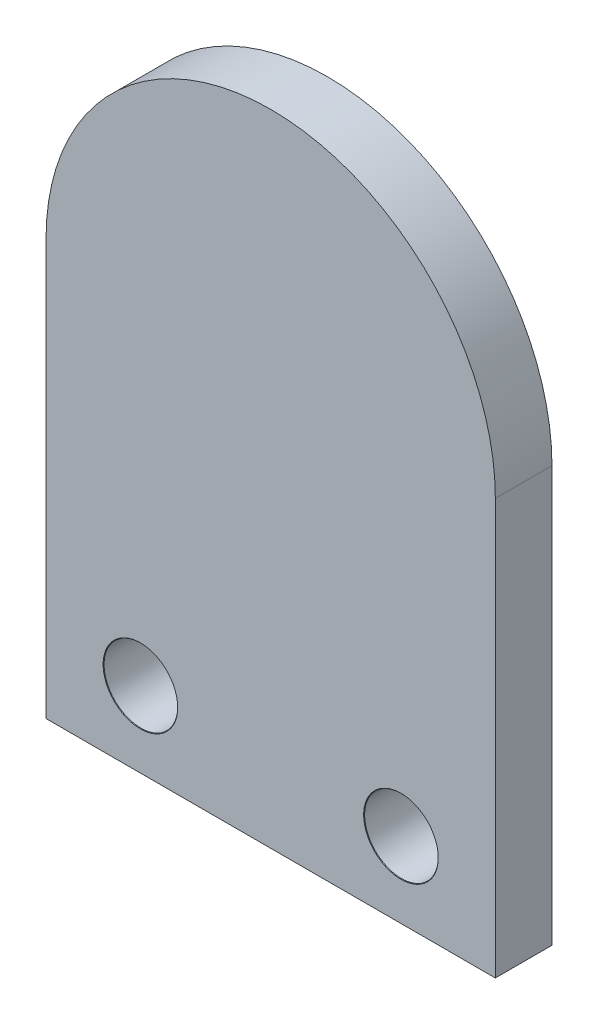
ISO-10303-21;
HEADER;
FILE_DESCRIPTION(('STEP AP214'),'2;1');
FILE_NAME('part.step','',(''),(''),'','','');
FILE_SCHEMA(('AUTOMOTIVE_DESIGN { 1 0 10303 214 1 1 1 1 }'));
ENDSEC;
DATA;
#1=APPLICATION_CONTEXT('core data for automotive mechanical design processes');
#2=APPLICATION_PROTOCOL_DEFINITION('international standard','automotive_design',2000,#1);
#3=PRODUCT_CONTEXT('',#1,'mechanical');
#4=PRODUCT('Part','Part','',(#3));
#5=PRODUCT_RELATED_PRODUCT_CATEGORY('part','',(#4));
#6=PRODUCT_DEFINITION_FORMATION('','',#4);
#7=PRODUCT_DEFINITION_CONTEXT('part definition',#1,'design');
#8=PRODUCT_DEFINITION('design','',#6,#7);
#9=PRODUCT_DEFINITION_SHAPE('','',#8);
#10=(LENGTH_UNIT() NAMED_UNIT(*) SI_UNIT(.MILLI.,.METRE.));
#11=(NAMED_UNIT(*) PLANE_ANGLE_UNIT() SI_UNIT($,.RADIAN.));
#12=(NAMED_UNIT(*) SI_UNIT($,.STERADIAN.) SOLID_ANGLE_UNIT());
#13=UNCERTAINTY_MEASURE_WITH_UNIT(LENGTH_MEASURE(1.E-05),#10,'distance_accuracy_value','');
#14=(GEOMETRIC_REPRESENTATION_CONTEXT(3) GLOBAL_UNCERTAINTY_ASSIGNED_CONTEXT((#13)) GLOBAL_UNIT_ASSIGNED_CONTEXT((#10,
#11,#12)) REPRESENTATION_CONTEXT('',''));
#15=CARTESIAN_POINT('',(0.,0.,0.));
#16=DIRECTION('',(0.,0.,1.));
#17=DIRECTION('',(1.,0.,0.));
#18=AXIS2_PLACEMENT_3D('',#15,#16,#17);
#19=CARTESIAN_POINT('',(0.,0.,3.));
#20=DIRECTION('',(0.,0.,-1.));
#21=DIRECTION('',(-1.,0.,0.));
#22=AXIS2_PLACEMENT_3D('',#19,#20,#21);
#23=CYLINDRICAL_SURFACE('',#22,11.9);
#24=CARTESIAN_POINT('',(0.,0.,0.));
#25=DIRECTION('',(0.,0.,1.));
#26=DIRECTION('',(1.,0.,0.));
#27=AXIS2_PLACEMENT_3D('',#24,#25,#26);
#28=CIRCLE('',#27,11.9);
#29=CARTESIAN_POINT('',(11.9,0.,0.));
#30=VERTEX_POINT('',#29);
#31=CARTESIAN_POINT('',(-11.9,0.,0.));
#32=VERTEX_POINT('',#31);
#33=EDGE_CURVE('E129',#30,#32,#28,.T.);
#34=ORIENTED_EDGE('',*,*,#33,.T.);
#35=DIRECTION('',(0.,0.,-1.));
#36=VECTOR('',#35,1.);
#37=CARTESIAN_POINT('',(-11.9,0.,3.));
#38=LINE('',#37,#36);
#39=CARTESIAN_POINT('',(-11.9,0.,3.));
#40=VERTEX_POINT('',#39);
#41=EDGE_CURVE('E118',#40,#32,#38,.T.);
#42=ORIENTED_EDGE('',*,*,#41,.F.);
#43=CARTESIAN_POINT('',(0.,0.,3.));
#44=DIRECTION('',(0.,0.,1.));
#45=DIRECTION('',(1.,0.,0.));
#46=AXIS2_PLACEMENT_3D('',#43,#44,#45);
#47=CIRCLE('',#46,11.9);
#48=CARTESIAN_POINT('',(11.9,0.,3.));
#49=VERTEX_POINT('',#48);
#50=EDGE_CURVE('E110',#49,#40,#47,.T.);
#51=ORIENTED_EDGE('',*,*,#50,.F.);
#52=DIRECTION('',(0.,0.,-1.));
#53=VECTOR('',#52,1.);
#54=CARTESIAN_POINT('',(11.9,0.,3.));
#55=LINE('',#54,#53);
#56=EDGE_CURVE('E125',#49,#30,#55,.T.);
#57=ORIENTED_EDGE('',*,*,#56,.T.);
#58=EDGE_LOOP('',(#34,#42,#51,#57));
#59=FACE_BOUND('',#58,.T.);
#60=ADVANCED_FACE('F55',(#59),#23,.T.);
#61=CARTESIAN_POINT('',(-11.9,0.,3.));
#62=DIRECTION('',(1.,0.,0.));
#63=DIRECTION('',(0.,0.,-1.));
#64=AXIS2_PLACEMENT_3D('',#61,#62,#63);
#65=PLANE('',#64);
#66=DIRECTION('',(0.,-1.,0.));
#67=VECTOR('',#66,1.);
#68=CARTESIAN_POINT('',(-11.9,0.,0.));
#69=LINE('',#68,#67);
#70=CARTESIAN_POINT('',(-11.9,-22.,0.));
#71=VERTEX_POINT('',#70);
#72=EDGE_CURVE('E116',#32,#71,#69,.T.);
#73=ORIENTED_EDGE('',*,*,#72,.T.);
#74=DIRECTION('',(0.,0.,-1.));
#75=VECTOR('',#74,1.);
#76=CARTESIAN_POINT('',(-11.9,-22.,3.));
#77=LINE('',#76,#75);
#78=CARTESIAN_POINT('',(-11.9,-22.,3.));
#79=VERTEX_POINT('',#78);
#80=EDGE_CURVE('E114',#79,#71,#77,.T.);
#81=ORIENTED_EDGE('',*,*,#80,.F.);
#82=DIRECTION('',(0.,-1.,0.));
#83=VECTOR('',#82,1.);
#84=CARTESIAN_POINT('',(-11.9,0.,3.));
#85=LINE('',#84,#83);
#86=EDGE_CURVE('E105',#40,#79,#85,.T.);
#87=ORIENTED_EDGE('',*,*,#86,.F.);
#88=ORIENTED_EDGE('',*,*,#41,.T.);
#89=EDGE_LOOP('',(#73,#81,#87,#88));
#90=FACE_BOUND('',#89,.T.);
#91=ADVANCED_FACE('F115',(#90),#65,.F.);
#92=CARTESIAN_POINT('',(-11.9,-22.,3.));
#93=DIRECTION('',(0.,1.,0.));
#94=DIRECTION('',(0.,0.,1.));
#95=AXIS2_PLACEMENT_3D('',#92,#93,#94);
#96=PLANE('',#95);
#97=DIRECTION('',(1.,0.,0.));
#98=VECTOR('',#97,1.);
#99=CARTESIAN_POINT('',(-11.9,-22.,0.));
#100=LINE('',#99,#98);
#101=CARTESIAN_POINT('',(11.9,-22.,0.));
#102=VERTEX_POINT('',#101);
#103=EDGE_CURVE('E91',#71,#102,#100,.T.);
#104=ORIENTED_EDGE('',*,*,#103,.T.);
#105=DIRECTION('',(0.,0.,-1.));
#106=VECTOR('',#105,1.);
#107=CARTESIAN_POINT('',(11.9,-22.,3.));
#108=LINE('',#107,#106);
#109=CARTESIAN_POINT('',(11.9,-22.,3.));
#110=VERTEX_POINT('',#109);
#111=EDGE_CURVE('E119',#110,#102,#108,.T.);
#112=ORIENTED_EDGE('',*,*,#111,.F.);
#113=DIRECTION('',(1.,0.,0.));
#114=VECTOR('',#113,1.);
#115=CARTESIAN_POINT('',(-11.9,-22.,3.));
#116=LINE('',#115,#114);
#117=EDGE_CURVE('E108',#79,#110,#116,.T.);
#118=ORIENTED_EDGE('',*,*,#117,.F.);
#119=ORIENTED_EDGE('',*,*,#80,.T.);
#120=EDGE_LOOP('',(#104,#112,#118,#119));
#121=FACE_BOUND('',#120,.T.);
#122=ADVANCED_FACE('F121',(#121),#96,.F.);
#123=CARTESIAN_POINT('',(11.9,-22.,3.));
#124=DIRECTION('',(-1.,0.,0.));
#125=DIRECTION('',(0.,0.,1.));
#126=AXIS2_PLACEMENT_3D('',#123,#124,#125);
#127=PLANE('',#126);
#128=DIRECTION('',(0.,1.,0.));
#129=VECTOR('',#128,1.);
#130=CARTESIAN_POINT('',(11.9,-22.,0.));
#131=LINE('',#130,#129);
#132=EDGE_CURVE('E97',#102,#30,#131,.T.);
#133=ORIENTED_EDGE('',*,*,#132,.T.);
#134=ORIENTED_EDGE('',*,*,#56,.F.);
#135=DIRECTION('',(0.,1.,0.));
#136=VECTOR('',#135,1.);
#137=CARTESIAN_POINT('',(11.9,-22.,3.));
#138=LINE('',#137,#136);
#139=EDGE_CURVE('E74',#110,#49,#138,.T.);
#140=ORIENTED_EDGE('',*,*,#139,.F.);
#141=ORIENTED_EDGE('',*,*,#111,.T.);
#142=EDGE_LOOP('',(#133,#134,#140,#141));
#143=FACE_BOUND('',#142,.T.);
#144=ADVANCED_FACE('F205',(#143),#127,.F.);
#145=CARTESIAN_POINT('',(0.,0.,3.));
#146=DIRECTION('',(0.,0.,1.));
#147=DIRECTION('',(1.,0.,0.));
#148=AXIS2_PLACEMENT_3D('',#145,#146,#147);
#149=PLANE('',#148);
#150=CARTESIAN_POINT('',(6.89999999999974,-18.,3.));
#151=DIRECTION('',(0.,0.,1.));
#152=DIRECTION('',(1.,0.,0.));
#153=AXIS2_PLACEMENT_3D('',#150,#151,#152);
#154=CIRCLE('',#153,1.975);
#155=CARTESIAN_POINT('',(8.87499999999974,-18.,3.));
#156=VERTEX_POINT('',#155);
#157=EDGE_CURVE('E406',#156,#156,#154,.T.);
#158=ORIENTED_EDGE('',*,*,#157,.F.);
#159=EDGE_LOOP('',(#158));
#160=FACE_BOUND('',#159,.T.);
#161=CARTESIAN_POINT('',(-6.90000000000027,-18.,3.));
#162=DIRECTION('',(0.,0.,1.));
#163=DIRECTION('',(1.,0.,0.));
#164=AXIS2_PLACEMENT_3D('',#161,#162,#163);
#165=CIRCLE('',#164,1.975);
#166=CARTESIAN_POINT('',(-4.92500000000026,-18.,3.));
#167=VERTEX_POINT('',#166);
#168=EDGE_CURVE('E169',#167,#167,#165,.T.);
#169=ORIENTED_EDGE('',*,*,#168,.F.);
#170=EDGE_LOOP('',(#169));
#171=FACE_BOUND('',#170,.T.);
#172=ORIENTED_EDGE('',*,*,#50,.T.);
#173=ORIENTED_EDGE('',*,*,#86,.T.);
#174=ORIENTED_EDGE('',*,*,#117,.T.);
#175=ORIENTED_EDGE('',*,*,#139,.T.);
#176=EDGE_LOOP('',(#172,#173,#174,#175));
#177=FACE_BOUND('',#176,.T.);
#178=ADVANCED_FACE('F106',(#160,#171,#177),#149,.T.);
#179=CARTESIAN_POINT('',(0.,0.,0.));
#180=DIRECTION('',(0.,0.,1.));
#181=DIRECTION('',(1.,0.,0.));
#182=AXIS2_PLACEMENT_3D('',#179,#180,#181);
#183=PLANE('',#182);
#184=CARTESIAN_POINT('',(6.89999999999974,-18.,0.));
#185=DIRECTION('',(0.,0.,1.));
#186=DIRECTION('',(1.,0.,0.));
#187=AXIS2_PLACEMENT_3D('',#184,#185,#186);
#188=CIRCLE('',#187,1.95);
#189=CARTESIAN_POINT('',(8.84999999999973,-18.,0.));
#190=VERTEX_POINT('',#189);
#191=EDGE_CURVE('E58',#190,#190,#188,.T.);
#192=ORIENTED_EDGE('',*,*,#191,.T.);
#193=EDGE_LOOP('',(#192));
#194=FACE_BOUND('',#193,.T.);
#195=CARTESIAN_POINT('',(-6.90000000000027,-18.,0.));
#196=DIRECTION('',(0.,0.,1.));
#197=DIRECTION('',(1.,0.,0.));
#198=AXIS2_PLACEMENT_3D('',#195,#196,#197);
#199=CIRCLE('',#198,1.95);
#200=CARTESIAN_POINT('',(-4.95000000000027,-18.,0.));
#201=VERTEX_POINT('',#200);
#202=EDGE_CURVE('E156',#201,#201,#199,.T.);
#203=ORIENTED_EDGE('',*,*,#202,.T.);
#204=EDGE_LOOP('',(#203));
#205=FACE_BOUND('',#204,.T.);
#206=CARTESIAN_POINT('',(6.,0.,0.));
#207=DIRECTION('',(0.,0.,1.));
#208=DIRECTION('',(1.,0.,0.));
#209=AXIS2_PLACEMENT_3D('',#206,#207,#208);
#210=CIRCLE('',#209,1.95);
#211=CARTESIAN_POINT('',(7.95,0.,0.));
#212=VERTEX_POINT('',#211);
#213=EDGE_CURVE('E13',#212,#212,#210,.F.);
#214=ORIENTED_EDGE('',*,*,#213,.F.);
#215=EDGE_LOOP('',(#214));
#216=FACE_BOUND('',#215,.T.);
#217=CARTESIAN_POINT('',(-1.68325892343959E-13,-6.,0.));
#218=DIRECTION('',(0.,0.,1.));
#219=DIRECTION('',(1.,0.,0.));
#220=AXIS2_PLACEMENT_3D('',#217,#218,#219);
#221=CIRCLE('',#220,1.9500000000002);
#222=CARTESIAN_POINT('',(1.95000000000003,-6.,0.));
#223=VERTEX_POINT('',#222);
#224=EDGE_CURVE('E65',#223,#223,#221,.F.);
#225=ORIENTED_EDGE('',*,*,#224,.F.);
#226=EDGE_LOOP('',(#225));
#227=FACE_BOUND('',#226,.T.);
#228=CARTESIAN_POINT('',(-6.,0.,0.));
#229=DIRECTION('',(0.,0.,1.));
#230=DIRECTION('',(1.,0.,0.));
#231=AXIS2_PLACEMENT_3D('',#228,#229,#230);
#232=CIRCLE('',#231,1.95);
#233=CARTESIAN_POINT('',(-4.05,0.,0.));
#234=VERTEX_POINT('',#233);
#235=EDGE_CURVE('E150',#234,#234,#232,.F.);
#236=ORIENTED_EDGE('',*,*,#235,.F.);
#237=EDGE_LOOP('',(#236));
#238=FACE_BOUND('',#237,.T.);
#239=CARTESIAN_POINT('',(0.,6.,0.));
#240=DIRECTION('',(0.,0.,1.));
#241=DIRECTION('',(1.,0.,0.));
#242=AXIS2_PLACEMENT_3D('',#239,#240,#241);
#243=CIRCLE('',#242,1.95);
#244=CARTESIAN_POINT('',(1.95,6.,0.));
#245=VERTEX_POINT('',#244);
#246=EDGE_CURVE('E146',#245,#245,#243,.F.);
#247=ORIENTED_EDGE('',*,*,#246,.F.);
#248=EDGE_LOOP('',(#247));
#249=FACE_BOUND('',#248,.T.);
#250=ORIENTED_EDGE('',*,*,#33,.F.);
#251=ORIENTED_EDGE('',*,*,#132,.F.);
#252=ORIENTED_EDGE('',*,*,#103,.F.);
#253=ORIENTED_EDGE('',*,*,#72,.F.);
#254=EDGE_LOOP('',(#250,#251,#252,#253));
#255=FACE_BOUND('',#254,.T.);
#256=ADVANCED_FACE('F195',(#194,#205,#216,#227,#238,#249,#255),#183,.F.);
#257=CARTESIAN_POINT('',(0.,6.,-3.));
#258=DIRECTION('',(0.,0.,1.));
#259=DIRECTION('',(1.,0.,0.));
#260=AXIS2_PLACEMENT_3D('',#257,#258,#259);
#261=CYLINDRICAL_SURFACE('',#260,1.95);
#262=CARTESIAN_POINT('',(0.,6.,-3.));
#263=DIRECTION('',(0.,0.,-1.));
#264=DIRECTION('',(-1.,0.,0.));
#265=AXIS2_PLACEMENT_3D('',#262,#263,#264);
#266=CIRCLE('',#265,1.95);
#267=CARTESIAN_POINT('',(-1.95,6.,-3.));
#268=VERTEX_POINT('',#267);
#269=EDGE_CURVE('E133',#268,#268,#266,.T.);
#270=ORIENTED_EDGE('',*,*,#269,.F.);
#271=EDGE_LOOP('',(#270));
#272=FACE_BOUND('',#271,.T.);
#273=ORIENTED_EDGE('',*,*,#246,.T.);
#274=EDGE_LOOP('',(#273));
#275=FACE_BOUND('',#274,.T.);
#276=ADVANCED_FACE('F192',(#272,#275),#261,.T.);
#277=CARTESIAN_POINT('',(0.,6.,-3.));
#278=DIRECTION('',(0.,0.,-1.));
#279=DIRECTION('',(-1.,0.,0.));
#280=AXIS2_PLACEMENT_3D('',#277,#278,#279);
#281=PLANE('',#280);
#282=ORIENTED_EDGE('',*,*,#269,.T.);
#283=EDGE_LOOP('',(#282));
#284=FACE_BOUND('',#283,.T.);
#285=ADVANCED_FACE('F190',(#284),#281,.T.);
#286=CARTESIAN_POINT('',(-6.,0.,-3.));
#287=DIRECTION('',(0.,0.,1.));
#288=DIRECTION('',(1.,0.,0.));
#289=AXIS2_PLACEMENT_3D('',#286,#287,#288);
#290=CYLINDRICAL_SURFACE('',#289,1.95);
#291=CARTESIAN_POINT('',(-6.,0.,-3.));
#292=DIRECTION('',(0.,0.,-1.));
#293=DIRECTION('',(-1.,0.,0.));
#294=AXIS2_PLACEMENT_3D('',#291,#292,#293);
#295=CIRCLE('',#294,1.95);
#296=CARTESIAN_POINT('',(-7.95,0.,-3.));
#297=VERTEX_POINT('',#296);
#298=EDGE_CURVE('E181',#297,#297,#295,.T.);
#299=ORIENTED_EDGE('',*,*,#298,.F.);
#300=EDGE_LOOP('',(#299));
#301=FACE_BOUND('',#300,.T.);
#302=ORIENTED_EDGE('',*,*,#235,.T.);
#303=EDGE_LOOP('',(#302));
#304=FACE_BOUND('',#303,.T.);
#305=ADVANCED_FACE('F249',(#301,#304),#290,.T.);
#306=CARTESIAN_POINT('',(-6.,0.,-3.));
#307=DIRECTION('',(0.,0.,-1.));
#308=DIRECTION('',(-1.,0.,0.));
#309=AXIS2_PLACEMENT_3D('',#306,#307,#308);
#310=PLANE('',#309);
#311=ORIENTED_EDGE('',*,*,#298,.T.);
#312=EDGE_LOOP('',(#311));
#313=FACE_BOUND('',#312,.T.);
#314=ADVANCED_FACE('F259',(#313),#310,.T.);
#315=CARTESIAN_POINT('',(-1.68325892343959E-13,-6.,-3.));
#316=DIRECTION('',(0.,0.,1.));
#317=DIRECTION('',(1.,0.,0.));
#318=AXIS2_PLACEMENT_3D('',#315,#316,#317);
#319=CYLINDRICAL_SURFACE('',#318,1.9500000000002);
#320=CARTESIAN_POINT('',(-1.68325892343959E-13,-6.,-3.));
#321=DIRECTION('',(0.,0.,-1.));
#322=DIRECTION('',(-1.,0.,0.));
#323=AXIS2_PLACEMENT_3D('',#320,#321,#322);
#324=CIRCLE('',#323,1.9500000000002);
#325=CARTESIAN_POINT('',(-1.95000000000037,-6.,-3.));
#326=VERTEX_POINT('',#325);
#327=EDGE_CURVE('E166',#326,#326,#324,.T.);
#328=ORIENTED_EDGE('',*,*,#327,.F.);
#329=EDGE_LOOP('',(#328));
#330=FACE_BOUND('',#329,.T.);
#331=ORIENTED_EDGE('',*,*,#224,.T.);
#332=EDGE_LOOP('',(#331));
#333=FACE_BOUND('',#332,.T.);
#334=ADVANCED_FACE('F270',(#330,#333),#319,.T.);
#335=CARTESIAN_POINT('',(-1.68325892343959E-13,-6.,-3.));
#336=DIRECTION('',(0.,0.,-1.));
#337=DIRECTION('',(-1.,0.,0.));
#338=AXIS2_PLACEMENT_3D('',#335,#336,#337);
#339=PLANE('',#338);
#340=ORIENTED_EDGE('',*,*,#327,.T.);
#341=EDGE_LOOP('',(#340));
#342=FACE_BOUND('',#341,.T.);
#343=ADVANCED_FACE('F281',(#342),#339,.T.);
#344=CARTESIAN_POINT('',(6.,0.,-3.));
#345=DIRECTION('',(0.,0.,1.));
#346=DIRECTION('',(1.,0.,0.));
#347=AXIS2_PLACEMENT_3D('',#344,#345,#346);
#348=CYLINDRICAL_SURFACE('',#347,1.95);
#349=CARTESIAN_POINT('',(6.,0.,-3.));
#350=DIRECTION('',(0.,0.,-1.));
#351=DIRECTION('',(-1.,0.,0.));
#352=AXIS2_PLACEMENT_3D('',#349,#350,#351);
#353=CIRCLE('',#352,1.95);
#354=CARTESIAN_POINT('',(4.05,0.,-3.));
#355=VERTEX_POINT('',#354);
#356=EDGE_CURVE('E159',#355,#355,#353,.T.);
#357=ORIENTED_EDGE('',*,*,#356,.F.);
#358=EDGE_LOOP('',(#357));
#359=FACE_BOUND('',#358,.T.);
#360=ORIENTED_EDGE('',*,*,#213,.T.);
#361=EDGE_LOOP('',(#360));
#362=FACE_BOUND('',#361,.T.);
#363=ADVANCED_FACE('F292',(#359,#362),#348,.T.);
#364=CARTESIAN_POINT('',(6.,0.,-3.));
#365=DIRECTION('',(0.,0.,-1.));
#366=DIRECTION('',(-1.,0.,0.));
#367=AXIS2_PLACEMENT_3D('',#364,#365,#366);
#368=PLANE('',#367);
#369=ORIENTED_EDGE('',*,*,#356,.T.);
#370=EDGE_LOOP('',(#369));
#371=FACE_BOUND('',#370,.T.);
#372=ADVANCED_FACE('F303',(#371),#368,.T.);
#373=CARTESIAN_POINT('',(-6.90000000000027,-18.,3.));
#374=DIRECTION('',(0.,0.,1.));
#375=DIRECTION('',(1.,0.,0.));
#376=AXIS2_PLACEMENT_3D('',#373,#374,#375);
#377=CYLINDRICAL_SURFACE('',#376,1.95);
#378=CARTESIAN_POINT('',(-6.90000000000027,-18.,2.975));
#379=DIRECTION('',(0.,0.,1.));
#380=DIRECTION('',(1.,0.,0.));
#381=AXIS2_PLACEMENT_3D('',#378,#379,#380);
#382=CIRCLE('',#381,1.95);
#383=CARTESIAN_POINT('',(-4.95000000000027,-18.,2.975));
#384=VERTEX_POINT('',#383);
#385=EDGE_CURVE('E160',#384,#384,#382,.T.);
#386=ORIENTED_EDGE('',*,*,#385,.T.);
#387=EDGE_LOOP('',(#386));
#388=FACE_BOUND('',#387,.T.);
#389=ORIENTED_EDGE('',*,*,#202,.F.);
#390=EDGE_LOOP('',(#389));
#391=FACE_BOUND('',#390,.T.);
#392=ADVANCED_FACE('F314',(#388,#391),#377,.F.);
#393=CARTESIAN_POINT('',(-6.90000000000027,-18.,3.));
#394=DIRECTION('',(0.,0.,1.));
#395=DIRECTION('',(1.,0.,0.));
#396=AXIS2_PLACEMENT_3D('',#393,#394,#395);
#397=CONICAL_SURFACE('',#396,1.975,0.785398163397431);
#398=ORIENTED_EDGE('',*,*,#385,.F.);
#399=EDGE_LOOP('',(#398));
#400=FACE_BOUND('',#399,.T.);
#401=ORIENTED_EDGE('',*,*,#168,.T.);
#402=EDGE_LOOP('',(#401));
#403=FACE_BOUND('',#402,.T.);
#404=ADVANCED_FACE('F337',(#400,#403),#397,.F.);
#405=CARTESIAN_POINT('',(6.89999999999974,-18.,3.));
#406=DIRECTION('',(0.,0.,1.));
#407=DIRECTION('',(1.,0.,0.));
#408=AXIS2_PLACEMENT_3D('',#405,#406,#407);
#409=CYLINDRICAL_SURFACE('',#408,1.95);
#410=CARTESIAN_POINT('',(6.89999999999974,-18.,2.975));
#411=DIRECTION('',(0.,0.,1.));
#412=DIRECTION('',(1.,0.,0.));
#413=AXIS2_PLACEMENT_3D('',#410,#411,#412);
#414=CIRCLE('',#413,1.95);
#415=CARTESIAN_POINT('',(8.84999999999973,-18.,2.975));
#416=VERTEX_POINT('',#415);
#417=EDGE_CURVE('E403',#416,#416,#414,.T.);
#418=ORIENTED_EDGE('',*,*,#417,.T.);
#419=EDGE_LOOP('',(#418));
#420=FACE_BOUND('',#419,.T.);
#421=ORIENTED_EDGE('',*,*,#191,.F.);
#422=EDGE_LOOP('',(#421));
#423=FACE_BOUND('',#422,.T.);
#424=ADVANCED_FACE('F347',(#420,#423),#409,.F.);
#425=CARTESIAN_POINT('',(6.89999999999974,-18.,3.));
#426=DIRECTION('',(0.,0.,1.));
#427=DIRECTION('',(1.,0.,0.));
#428=AXIS2_PLACEMENT_3D('',#425,#426,#427);
#429=CONICAL_SURFACE('',#428,1.975,0.785398163397414);
#430=ORIENTED_EDGE('',*,*,#417,.F.);
#431=EDGE_LOOP('',(#430));
#432=FACE_BOUND('',#431,.T.);
#433=ORIENTED_EDGE('',*,*,#157,.T.);
#434=EDGE_LOOP('',(#433));
#435=FACE_BOUND('',#434,.T.);
#436=ADVANCED_FACE('F358',(#432,#435),#429,.F.);
#437=CLOSED_SHELL('',(#60,#91,#122,#144,#178,#256,#276,#285,#305,#314,#334,#343,#363,#372,#392,
#404,#424,#436));
#438=MANIFOLD_SOLID_BREP('B2',#437);
#439=ADVANCED_BREP_SHAPE_REPRESENTATION('',(#18,#438),#14);
#440=SHAPE_DEFINITION_REPRESENTATION(#9,#439);
ENDSEC;
END-ISO-10303-21;
